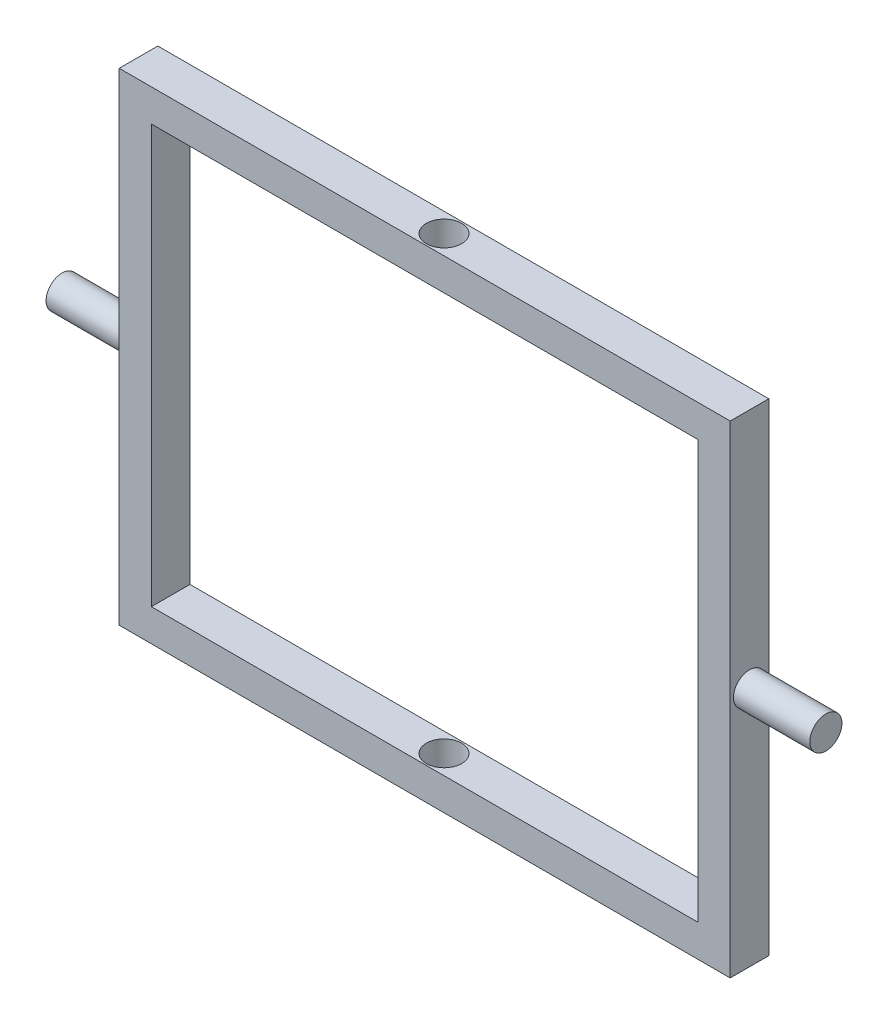
ISO-10303-21;
HEADER;
FILE_DESCRIPTION(('STEP AP214'),'2;1');
FILE_NAME('part.step','',(''),(''),'','','');
FILE_SCHEMA(('AUTOMOTIVE_DESIGN { 1 0 10303 214 1 1 1 1 }'));
ENDSEC;
DATA;
#1=APPLICATION_CONTEXT('core data for automotive mechanical design processes');
#2=APPLICATION_PROTOCOL_DEFINITION('international standard','automotive_design',2000,#1);
#3=PRODUCT_CONTEXT('',#1,'mechanical');
#4=PRODUCT('Part','Part','',(#3));
#5=PRODUCT_RELATED_PRODUCT_CATEGORY('part','',(#4));
#6=PRODUCT_DEFINITION_FORMATION('','',#4);
#7=PRODUCT_DEFINITION_CONTEXT('part definition',#1,'design');
#8=PRODUCT_DEFINITION('design','',#6,#7);
#9=PRODUCT_DEFINITION_SHAPE('','',#8);
#10=(LENGTH_UNIT() NAMED_UNIT(*) SI_UNIT(.MILLI.,.METRE.));
#11=(NAMED_UNIT(*) PLANE_ANGLE_UNIT() SI_UNIT($,.RADIAN.));
#12=(NAMED_UNIT(*) SI_UNIT($,.STERADIAN.) SOLID_ANGLE_UNIT());
#13=UNCERTAINTY_MEASURE_WITH_UNIT(LENGTH_MEASURE(1.E-05),#10,'distance_accuracy_value','');
#14=(GEOMETRIC_REPRESENTATION_CONTEXT(3) GLOBAL_UNCERTAINTY_ASSIGNED_CONTEXT((#13)) GLOBAL_UNIT_ASSIGNED_CONTEXT((#10,
#11,#12)) REPRESENTATION_CONTEXT('',''));
#15=CARTESIAN_POINT('',(0.,0.,0.));
#16=DIRECTION('',(0.,0.,1.));
#17=DIRECTION('',(1.,0.,0.));
#18=AXIS2_PLACEMENT_3D('',#15,#16,#17);
#19=CARTESIAN_POINT('',(475.,375.,-30.));
#20=DIRECTION('',(1.,0.,0.));
#21=DIRECTION('',(0.,1.,0.));
#22=AXIS2_PLACEMENT_3D('',#19,#20,#21);
#23=PLANE('',#22);
#24=CARTESIAN_POINT('',(475.,0.,0.));
#25=DIRECTION('',(1.,0.,0.));
#26=DIRECTION('',(0.,1.,0.));
#27=AXIS2_PLACEMENT_3D('',#24,#25,#26);
#28=CIRCLE('',#27,25.);
#29=CARTESIAN_POINT('',(475.,-24.9999999999999,0.));
#30=VERTEX_POINT('',#29);
#31=EDGE_CURVE('E199',#30,#30,#28,.T.);
#32=ORIENTED_EDGE('',*,*,#31,.F.);
#33=EDGE_LOOP('',(#32));
#34=FACE_BOUND('',#33,.T.);
#35=DIRECTION('',(0.,0.,1.));
#36=VECTOR('',#35,1.);
#37=CARTESIAN_POINT('',(475.,375.,-30.));
#38=LINE('',#37,#36);
#39=CARTESIAN_POINT('',(475.,375.,-30.));
#40=VERTEX_POINT('',#39);
#41=CARTESIAN_POINT('',(475.,375.,30.));
#42=VERTEX_POINT('',#41);
#43=EDGE_CURVE('E162',#40,#42,#38,.T.);
#44=ORIENTED_EDGE('',*,*,#43,.T.);
#45=DIRECTION('',(0.,1.,0.));
#46=VECTOR('',#45,1.);
#47=CARTESIAN_POINT('',(475.,375.,30.));
#48=LINE('',#47,#46);
#49=CARTESIAN_POINT('',(475.,-375.,30.));
#50=VERTEX_POINT('',#49);
#51=EDGE_CURVE('E129',#50,#42,#48,.T.);
#52=ORIENTED_EDGE('',*,*,#51,.F.);
#53=DIRECTION('',(0.,0.,1.));
#54=VECTOR('',#53,1.);
#55=CARTESIAN_POINT('',(475.,-375.,-30.));
#56=LINE('',#55,#54);
#57=CARTESIAN_POINT('',(475.,-375.,-30.));
#58=VERTEX_POINT('',#57);
#59=EDGE_CURVE('E40',#58,#50,#56,.T.);
#60=ORIENTED_EDGE('',*,*,#59,.F.);
#61=DIRECTION('',(0.,1.,0.));
#62=VECTOR('',#61,1.);
#63=CARTESIAN_POINT('',(475.,375.,-30.));
#64=LINE('',#63,#62);
#65=EDGE_CURVE('E148',#58,#40,#64,.T.);
#66=ORIENTED_EDGE('',*,*,#65,.T.);
#67=EDGE_LOOP('',(#44,#52,#60,#66));
#68=FACE_BOUND('',#67,.T.);
#69=ADVANCED_FACE('F33',(#34,#68),#23,.T.);
#70=CARTESIAN_POINT('',(-475.,-375.,-30.));
#71=DIRECTION('',(0.,-1.,0.));
#72=DIRECTION('',(0.,0.,-1.));
#73=AXIS2_PLACEMENT_3D('',#70,#71,#72);
#74=PLANE('',#73);
#75=CARTESIAN_POINT('',(0.,-375.,0.));
#76=DIRECTION('',(0.,-1.,0.));
#77=DIRECTION('',(0.,0.,-1.));
#78=AXIS2_PLACEMENT_3D('',#75,#76,#77);
#79=CIRCLE('',#78,27.5);
#80=CARTESIAN_POINT('',(0.,-375.,-27.5));
#81=VERTEX_POINT('',#80);
#82=EDGE_CURVE('E213',#81,#81,#79,.F.);
#83=ORIENTED_EDGE('',*,*,#82,.T.);
#84=EDGE_LOOP('',(#83));
#85=FACE_BOUND('',#84,.T.);
#86=ORIENTED_EDGE('',*,*,#59,.T.);
#87=DIRECTION('',(1.,0.,0.));
#88=VECTOR('',#87,1.);
#89=CARTESIAN_POINT('',(-475.,-375.,30.));
#90=LINE('',#89,#88);
#91=CARTESIAN_POINT('',(-475.,-375.,30.));
#92=VERTEX_POINT('',#91);
#93=EDGE_CURVE('E138',#92,#50,#90,.T.);
#94=ORIENTED_EDGE('',*,*,#93,.F.);
#95=DIRECTION('',(0.,0.,1.));
#96=VECTOR('',#95,1.);
#97=CARTESIAN_POINT('',(-475.,-375.,-30.));
#98=LINE('',#97,#96);
#99=CARTESIAN_POINT('',(-475.,-375.,-30.));
#100=VERTEX_POINT('',#99);
#101=EDGE_CURVE('E164',#100,#92,#98,.T.);
#102=ORIENTED_EDGE('',*,*,#101,.F.);
#103=DIRECTION('',(1.,0.,0.));
#104=VECTOR('',#103,1.);
#105=CARTESIAN_POINT('',(-475.,-375.,-30.));
#106=LINE('',#105,#104);
#107=EDGE_CURVE('E159',#100,#58,#106,.T.);
#108=ORIENTED_EDGE('',*,*,#107,.T.);
#109=EDGE_LOOP('',(#86,#94,#102,#108));
#110=FACE_BOUND('',#109,.T.);
#111=ADVANCED_FACE('F175',(#85,#110),#74,.T.);
#112=CARTESIAN_POINT('',(-475.,375.,-30.));
#113=DIRECTION('',(-1.,0.,0.));
#114=DIRECTION('',(0.,-1.,0.));
#115=AXIS2_PLACEMENT_3D('',#112,#113,#114);
#116=PLANE('',#115);
#117=CARTESIAN_POINT('',(-475.,0.,0.));
#118=DIRECTION('',(-1.,0.,0.));
#119=DIRECTION('',(0.,-1.,0.));
#120=AXIS2_PLACEMENT_3D('',#117,#118,#119);
#121=CIRCLE('',#120,25.);
#122=CARTESIAN_POINT('',(-475.,25.0000000000001,0.));
#123=VERTEX_POINT('',#122);
#124=EDGE_CURVE('E11',#123,#123,#121,.T.);
#125=ORIENTED_EDGE('',*,*,#124,.F.);
#126=EDGE_LOOP('',(#125));
#127=FACE_BOUND('',#126,.T.);
#128=ORIENTED_EDGE('',*,*,#101,.T.);
#129=DIRECTION('',(0.,-1.,0.));
#130=VECTOR('',#129,1.);
#131=CARTESIAN_POINT('',(-475.,375.,30.));
#132=LINE('',#131,#130);
#133=CARTESIAN_POINT('',(-475.,375.,30.));
#134=VERTEX_POINT('',#133);
#135=EDGE_CURVE('E135',#134,#92,#132,.T.);
#136=ORIENTED_EDGE('',*,*,#135,.F.);
#137=DIRECTION('',(0.,0.,1.));
#138=VECTOR('',#137,1.);
#139=CARTESIAN_POINT('',(-475.,375.,-30.));
#140=LINE('',#139,#138);
#141=CARTESIAN_POINT('',(-475.,375.,-30.));
#142=VERTEX_POINT('',#141);
#143=EDGE_CURVE('E166',#142,#134,#140,.T.);
#144=ORIENTED_EDGE('',*,*,#143,.F.);
#145=DIRECTION('',(0.,-1.,0.));
#146=VECTOR('',#145,1.);
#147=CARTESIAN_POINT('',(-475.,375.,-30.));
#148=LINE('',#147,#146);
#149=EDGE_CURVE('E156',#142,#100,#148,.T.);
#150=ORIENTED_EDGE('',*,*,#149,.T.);
#151=EDGE_LOOP('',(#128,#136,#144,#150));
#152=FACE_BOUND('',#151,.T.);
#153=ADVANCED_FACE('F181',(#127,#152),#116,.T.);
#154=CARTESIAN_POINT('',(-475.,375.,-30.));
#155=DIRECTION('',(0.,1.,0.));
#156=DIRECTION('',(0.,0.,1.));
#157=AXIS2_PLACEMENT_3D('',#154,#155,#156);
#158=PLANE('',#157);
#159=CARTESIAN_POINT('',(0.,375.,0.));
#160=DIRECTION('',(0.,1.,0.));
#161=DIRECTION('',(0.,0.,1.));
#162=AXIS2_PLACEMENT_3D('',#159,#160,#161);
#163=CIRCLE('',#162,27.5);
#164=CARTESIAN_POINT('',(0.,375.,27.5));
#165=VERTEX_POINT('',#164);
#166=EDGE_CURVE('E205',#165,#165,#163,.T.);
#167=ORIENTED_EDGE('',*,*,#166,.F.);
#168=EDGE_LOOP('',(#167));
#169=FACE_BOUND('',#168,.T.);
#170=ORIENTED_EDGE('',*,*,#143,.T.);
#171=DIRECTION('',(-1.,0.,0.));
#172=VECTOR('',#171,1.);
#173=CARTESIAN_POINT('',(-475.,375.,30.));
#174=LINE('',#173,#172);
#175=EDGE_CURVE('E132',#42,#134,#174,.T.);
#176=ORIENTED_EDGE('',*,*,#175,.F.);
#177=ORIENTED_EDGE('',*,*,#43,.F.);
#178=DIRECTION('',(-1.,0.,0.));
#179=VECTOR('',#178,1.);
#180=CARTESIAN_POINT('',(-475.,375.,-30.));
#181=LINE('',#180,#179);
#182=EDGE_CURVE('E153',#40,#142,#181,.T.);
#183=ORIENTED_EDGE('',*,*,#182,.T.);
#184=EDGE_LOOP('',(#170,#176,#177,#183));
#185=FACE_BOUND('',#184,.T.);
#186=ADVANCED_FACE('F170',(#169,#185),#158,.T.);
#187=CARTESIAN_POINT('',(0.,0.,-30.));
#188=DIRECTION('',(0.,0.,1.));
#189=DIRECTION('',(1.,0.,0.));
#190=AXIS2_PLACEMENT_3D('',#187,#188,#189);
#191=PLANE('',#190);
#192=DIRECTION('',(1.,0.,0.));
#193=VECTOR('',#192,1.);
#194=CARTESIAN_POINT('',(-425.,-325.,-30.));
#195=LINE('',#194,#193);
#196=CARTESIAN_POINT('',(-425.,-325.,-30.));
#197=VERTEX_POINT('',#196);
#198=CARTESIAN_POINT('',(425.,-325.,-30.));
#199=VERTEX_POINT('',#198);
#200=EDGE_CURVE('E109',#197,#199,#195,.T.);
#201=ORIENTED_EDGE('',*,*,#200,.T.);
#202=DIRECTION('',(0.,1.,0.));
#203=VECTOR('',#202,1.);
#204=CARTESIAN_POINT('',(425.,325.,-30.));
#205=LINE('',#204,#203);
#206=CARTESIAN_POINT('',(425.,325.,-30.));
#207=VERTEX_POINT('',#206);
#208=EDGE_CURVE('E141',#199,#207,#205,.T.);
#209=ORIENTED_EDGE('',*,*,#208,.T.);
#210=DIRECTION('',(-1.,0.,0.));
#211=VECTOR('',#210,1.);
#212=CARTESIAN_POINT('',(-425.,325.,-30.));
#213=LINE('',#212,#211);
#214=CARTESIAN_POINT('',(-425.,325.,-30.));
#215=VERTEX_POINT('',#214);
#216=EDGE_CURVE('E104',#207,#215,#213,.T.);
#217=ORIENTED_EDGE('',*,*,#216,.T.);
#218=DIRECTION('',(0.,-1.,0.));
#219=VECTOR('',#218,1.);
#220=CARTESIAN_POINT('',(-425.,325.,-30.));
#221=LINE('',#220,#219);
#222=EDGE_CURVE('E47',#215,#197,#221,.T.);
#223=ORIENTED_EDGE('',*,*,#222,.T.);
#224=EDGE_LOOP('',(#201,#209,#217,#223));
#225=FACE_BOUND('',#224,.T.);
#226=ORIENTED_EDGE('',*,*,#65,.F.);
#227=ORIENTED_EDGE('',*,*,#107,.F.);
#228=ORIENTED_EDGE('',*,*,#149,.F.);
#229=ORIENTED_EDGE('',*,*,#182,.F.);
#230=EDGE_LOOP('',(#226,#227,#228,#229));
#231=FACE_BOUND('',#230,.T.);
#232=ADVANCED_FACE('F179',(#225,#231),#191,.F.);
#233=CARTESIAN_POINT('',(425.,325.,-30.));
#234=DIRECTION('',(1.,0.,0.));
#235=DIRECTION('',(0.,1.,0.));
#236=AXIS2_PLACEMENT_3D('',#233,#234,#235);
#237=PLANE('',#236);
#238=DIRECTION('',(0.,0.,1.));
#239=VECTOR('',#238,1.);
#240=CARTESIAN_POINT('',(425.,-325.,-30.));
#241=LINE('',#240,#239);
#242=CARTESIAN_POINT('',(425.,-325.,30.));
#243=VERTEX_POINT('',#242);
#244=EDGE_CURVE('E114',#199,#243,#241,.T.);
#245=ORIENTED_EDGE('',*,*,#244,.T.);
#246=DIRECTION('',(0.,1.,0.));
#247=VECTOR('',#246,1.);
#248=CARTESIAN_POINT('',(425.,325.,30.));
#249=LINE('',#248,#247);
#250=CARTESIAN_POINT('',(425.,325.,30.));
#251=VERTEX_POINT('',#250);
#252=EDGE_CURVE('E112',#243,#251,#249,.T.);
#253=ORIENTED_EDGE('',*,*,#252,.T.);
#254=DIRECTION('',(0.,0.,1.));
#255=VECTOR('',#254,1.);
#256=CARTESIAN_POINT('',(425.,325.,-30.));
#257=LINE('',#256,#255);
#258=EDGE_CURVE('E97',#207,#251,#257,.T.);
#259=ORIENTED_EDGE('',*,*,#258,.F.);
#260=ORIENTED_EDGE('',*,*,#208,.F.);
#261=EDGE_LOOP('',(#245,#253,#259,#260));
#262=FACE_BOUND('',#261,.T.);
#263=ADVANCED_FACE('F113',(#262),#237,.F.);
#264=CARTESIAN_POINT('',(-425.,-325.,-30.));
#265=DIRECTION('',(0.,-1.,0.));
#266=DIRECTION('',(0.,0.,-1.));
#267=AXIS2_PLACEMENT_3D('',#264,#265,#266);
#268=PLANE('',#267);
#269=CARTESIAN_POINT('',(0.,-325.,0.));
#270=DIRECTION('',(0.,-1.,0.));
#271=DIRECTION('',(0.,0.,-1.));
#272=AXIS2_PLACEMENT_3D('',#269,#270,#271);
#273=CIRCLE('',#272,27.5);
#274=CARTESIAN_POINT('',(0.,-325.,-27.5));
#275=VERTEX_POINT('',#274);
#276=EDGE_CURVE('E216',#275,#275,#273,.T.);
#277=ORIENTED_EDGE('',*,*,#276,.T.);
#278=EDGE_LOOP('',(#277));
#279=FACE_BOUND('',#278,.T.);
#280=DIRECTION('',(0.,0.,1.));
#281=VECTOR('',#280,1.);
#282=CARTESIAN_POINT('',(-425.,-325.,-30.));
#283=LINE('',#282,#281);
#284=CARTESIAN_POINT('',(-425.,-325.,30.));
#285=VERTEX_POINT('',#284);
#286=EDGE_CURVE('E149',#197,#285,#283,.T.);
#287=ORIENTED_EDGE('',*,*,#286,.T.);
#288=DIRECTION('',(1.,0.,0.));
#289=VECTOR('',#288,1.);
#290=CARTESIAN_POINT('',(-425.,-325.,30.));
#291=LINE('',#290,#289);
#292=EDGE_CURVE('E124',#285,#243,#291,.T.);
#293=ORIENTED_EDGE('',*,*,#292,.T.);
#294=ORIENTED_EDGE('',*,*,#244,.F.);
#295=ORIENTED_EDGE('',*,*,#200,.F.);
#296=EDGE_LOOP('',(#287,#293,#294,#295));
#297=FACE_BOUND('',#296,.T.);
#298=ADVANCED_FACE('F220',(#279,#297),#268,.F.);
#299=CARTESIAN_POINT('',(-425.,325.,-30.));
#300=DIRECTION('',(-1.,0.,0.));
#301=DIRECTION('',(0.,-1.,0.));
#302=AXIS2_PLACEMENT_3D('',#299,#300,#301);
#303=PLANE('',#302);
#304=DIRECTION('',(0.,0.,1.));
#305=VECTOR('',#304,1.);
#306=CARTESIAN_POINT('',(-425.,325.,-30.));
#307=LINE('',#306,#305);
#308=CARTESIAN_POINT('',(-425.,325.,30.));
#309=VERTEX_POINT('',#308);
#310=EDGE_CURVE('E108',#215,#309,#307,.T.);
#311=ORIENTED_EDGE('',*,*,#310,.T.);
#312=DIRECTION('',(0.,-1.,0.));
#313=VECTOR('',#312,1.);
#314=CARTESIAN_POINT('',(-425.,325.,30.));
#315=LINE('',#314,#313);
#316=EDGE_CURVE('E122',#309,#285,#315,.T.);
#317=ORIENTED_EDGE('',*,*,#316,.T.);
#318=ORIENTED_EDGE('',*,*,#286,.F.);
#319=ORIENTED_EDGE('',*,*,#222,.F.);
#320=EDGE_LOOP('',(#311,#317,#318,#319));
#321=FACE_BOUND('',#320,.T.);
#322=ADVANCED_FACE('F255',(#321),#303,.F.);
#323=CARTESIAN_POINT('',(-425.,325.,-30.));
#324=DIRECTION('',(0.,1.,0.));
#325=DIRECTION('',(0.,0.,1.));
#326=AXIS2_PLACEMENT_3D('',#323,#324,#325);
#327=PLANE('',#326);
#328=CARTESIAN_POINT('',(0.,325.,0.));
#329=DIRECTION('',(0.,-1.,0.));
#330=DIRECTION('',(0.,0.,-1.));
#331=AXIS2_PLACEMENT_3D('',#328,#329,#330);
#332=CIRCLE('',#331,27.5);
#333=CARTESIAN_POINT('',(0.,325.,-27.5));
#334=VERTEX_POINT('',#333);
#335=EDGE_CURVE('E210',#334,#334,#332,.T.);
#336=ORIENTED_EDGE('',*,*,#335,.F.);
#337=EDGE_LOOP('',(#336));
#338=FACE_BOUND('',#337,.T.);
#339=ORIENTED_EDGE('',*,*,#258,.T.);
#340=DIRECTION('',(-1.,0.,0.));
#341=VECTOR('',#340,1.);
#342=CARTESIAN_POINT('',(-425.,325.,30.));
#343=LINE('',#342,#341);
#344=EDGE_CURVE('E101',#251,#309,#343,.T.);
#345=ORIENTED_EDGE('',*,*,#344,.T.);
#346=ORIENTED_EDGE('',*,*,#310,.F.);
#347=ORIENTED_EDGE('',*,*,#216,.F.);
#348=EDGE_LOOP('',(#339,#345,#346,#347));
#349=FACE_BOUND('',#348,.T.);
#350=ADVANCED_FACE('F99',(#338,#349),#327,.F.);
#351=CARTESIAN_POINT('',(0.,0.,30.));
#352=DIRECTION('',(0.,0.,1.));
#353=DIRECTION('',(1.,0.,0.));
#354=AXIS2_PLACEMENT_3D('',#351,#352,#353);
#355=PLANE('',#354);
#356=ORIENTED_EDGE('',*,*,#51,.T.);
#357=ORIENTED_EDGE('',*,*,#175,.T.);
#358=ORIENTED_EDGE('',*,*,#135,.T.);
#359=ORIENTED_EDGE('',*,*,#93,.T.);
#360=EDGE_LOOP('',(#356,#357,#358,#359));
#361=FACE_BOUND('',#360,.T.);
#362=ORIENTED_EDGE('',*,*,#344,.F.);
#363=ORIENTED_EDGE('',*,*,#252,.F.);
#364=ORIENTED_EDGE('',*,*,#292,.F.);
#365=ORIENTED_EDGE('',*,*,#316,.F.);
#366=EDGE_LOOP('',(#362,#363,#364,#365));
#367=FACE_BOUND('',#366,.T.);
#368=ADVANCED_FACE('F120',(#361,#367),#355,.T.);
#369=CARTESIAN_POINT('',(593.75,0.,0.));
#370=DIRECTION('',(-1.,0.,0.));
#371=DIRECTION('',(0.,-1.,0.));
#372=AXIS2_PLACEMENT_3D('',#369,#370,#371);
#373=CYLINDRICAL_SURFACE('',#372,25.);
#374=CARTESIAN_POINT('',(593.75,0.,0.));
#375=DIRECTION('',(1.,0.,0.));
#376=DIRECTION('',(0.,1.,0.));
#377=AXIS2_PLACEMENT_3D('',#374,#375,#376);
#378=CIRCLE('',#377,25.);
#379=CARTESIAN_POINT('',(593.75,-24.9999999999999,0.));
#380=VERTEX_POINT('',#379);
#381=EDGE_CURVE('E118',#380,#380,#378,.T.);
#382=CARTESIAN_POINT('',(593.75,-24.9999999999999,0.));
#383=CARTESIAN_POINT('',(592.513020833334,-24.9999999999999,0.));
#384=CARTESIAN_POINT('',(591.276041666667,-24.9999999999999,0.));
#385=CARTESIAN_POINT('',(588.802083333333,-24.9999999999999,0.));
#386=CARTESIAN_POINT('',(587.565104166667,-24.9999999999999,0.));
#387=CARTESIAN_POINT('',(585.091145833334,-24.9999999999999,0.));
#388=CARTESIAN_POINT('',(583.854166666667,-24.9999999999999,0.));
#389=CARTESIAN_POINT('',(581.380208333333,-24.9999999999999,0.));
#390=CARTESIAN_POINT('',(580.143229166667,-24.9999999999999,0.));
#391=CARTESIAN_POINT('',(577.669270833333,-24.9999999999999,0.));
#392=CARTESIAN_POINT('',(576.432291666667,-24.9999999999999,0.));
#393=CARTESIAN_POINT('',(573.958333333334,-24.9999999999999,0.));
#394=CARTESIAN_POINT('',(572.721354166667,-24.9999999999999,0.));
#395=CARTESIAN_POINT('',(570.247395833333,-24.9999999999999,0.));
#396=CARTESIAN_POINT('',(569.010416666667,-24.9999999999999,0.));
#397=CARTESIAN_POINT('',(566.536458333334,-24.9999999999999,0.));
#398=CARTESIAN_POINT('',(565.299479166667,-24.9999999999999,0.));
#399=CARTESIAN_POINT('',(562.825520833333,-24.9999999999999,0.));
#400=CARTESIAN_POINT('',(561.588541666667,-24.9999999999999,0.));
#401=CARTESIAN_POINT('',(559.114583333333,-24.9999999999999,0.));
#402=CARTESIAN_POINT('',(557.877604166667,-24.9999999999999,0.));
#403=CARTESIAN_POINT('',(555.403645833334,-24.9999999999999,0.));
#404=CARTESIAN_POINT('',(554.166666666667,-24.9999999999999,0.));
#405=CARTESIAN_POINT('',(551.692708333333,-24.9999999999999,0.));
#406=CARTESIAN_POINT('',(550.455729166667,-24.9999999999999,0.));
#407=CARTESIAN_POINT('',(547.981770833334,-24.9999999999999,0.));
#408=CARTESIAN_POINT('',(546.744791666667,-24.9999999999999,0.));
#409=CARTESIAN_POINT('',(544.270833333333,-24.9999999999999,0.));
#410=CARTESIAN_POINT('',(543.033854166667,-24.9999999999999,0.));
#411=CARTESIAN_POINT('',(540.559895833333,-24.9999999999999,0.));
#412=CARTESIAN_POINT('',(539.322916666667,-24.9999999999999,0.));
#413=CARTESIAN_POINT('',(536.848958333333,-24.9999999999999,0.));
#414=CARTESIAN_POINT('',(535.611979166667,-24.9999999999999,0.));
#415=CARTESIAN_POINT('',(533.138020833333,-24.9999999999999,0.));
#416=CARTESIAN_POINT('',(531.901041666667,-24.9999999999999,0.));
#417=CARTESIAN_POINT('',(529.427083333334,-24.9999999999999,0.));
#418=CARTESIAN_POINT('',(528.190104166667,-24.9999999999999,0.));
#419=CARTESIAN_POINT('',(525.716145833333,-24.9999999999999,0.));
#420=CARTESIAN_POINT('',(524.479166666667,-24.9999999999999,0.));
#421=CARTESIAN_POINT('',(522.005208333333,-24.9999999999999,0.));
#422=CARTESIAN_POINT('',(520.768229166667,-24.9999999999999,0.));
#423=CARTESIAN_POINT('',(518.294270833334,-24.9999999999999,0.));
#424=CARTESIAN_POINT('',(517.057291666667,-24.9999999999999,0.));
#425=CARTESIAN_POINT('',(514.583333333333,-24.9999999999999,0.));
#426=CARTESIAN_POINT('',(513.346354166667,-24.9999999999999,0.));
#427=CARTESIAN_POINT('',(510.872395833334,-24.9999999999999,0.));
#428=CARTESIAN_POINT('',(509.635416666667,-24.9999999999999,0.));
#429=CARTESIAN_POINT('',(507.161458333333,-24.9999999999999,0.));
#430=CARTESIAN_POINT('',(505.924479166667,-24.9999999999999,0.));
#431=CARTESIAN_POINT('',(503.450520833334,-24.9999999999999,0.));
#432=CARTESIAN_POINT('',(502.213541666667,-24.9999999999999,0.));
#433=CARTESIAN_POINT('',(499.739583333334,-24.9999999999999,0.));
#434=CARTESIAN_POINT('',(498.502604166667,-24.9999999999999,0.));
#435=CARTESIAN_POINT('',(496.028645833333,-24.9999999999999,0.));
#436=CARTESIAN_POINT('',(494.791666666667,-24.9999999999999,0.));
#437=CARTESIAN_POINT('',(492.317708333333,-24.9999999999999,0.));
#438=CARTESIAN_POINT('',(491.080729166667,-24.9999999999999,0.));
#439=CARTESIAN_POINT('',(488.606770833333,-24.9999999999999,0.));
#440=CARTESIAN_POINT('',(487.369791666667,-24.9999999999999,0.));
#441=CARTESIAN_POINT('',(484.895833333334,-24.9999999999999,0.));
#442=CARTESIAN_POINT('',(483.658854166667,-24.9999999999999,0.));
#443=CARTESIAN_POINT('',(481.184895833334,-24.9999999999999,0.));
#444=CARTESIAN_POINT('',(479.947916666667,-24.9999999999999,0.));
#445=CARTESIAN_POINT('',(477.473958333333,-24.9999999999999,0.));
#446=CARTESIAN_POINT('',(476.236979166667,-24.9999999999999,0.));
#447=CARTESIAN_POINT('',(475.,-24.9999999999999,0.));
#448=B_SPLINE_CURVE_WITH_KNOTS('',3,(#382,#383,#384,#385,#386,#387,#388,#389,#390,#391,#392,
#393,#394,#395,#396,#397,#398,#399,#400,#401,#402,#403,#404,#405,#406,#407,#408,#409,#410,#411,
#412,#413,#414,#415,#416,#417,#418,#419,#420,#421,#422,#423,#424,#425,#426,#427,#428,#429,#430,
#431,#432,#433,#434,#435,#436,#437,#438,#439,#440,#441,#442,#443,#444,#445,#446,#447),
.UNSPECIFIED.,.F.,.F.,(4,2,2,2,2,2,2,2,2,2,2,2,2,2,2,2,2,2,2,2,2,2,2,2,2,2,2,2,2,2,2,2,4),(0.,
3.71093750000007,7.42187500000002,11.1328125000001,14.84375,18.5546875,22.2656250000001,
25.9765625,29.6875000000001,33.3984375,37.109375,40.8203125000001,44.53125,48.2421875000001,
51.953125,55.6640625000001,59.3750000000001,63.0859375,66.7968750000001,70.5078125,74.21875,
77.9296875000001,81.640625,85.3515625000001,89.0625,92.7734375,96.4843750000001,100.1953125,
103.90625,107.6171875,111.328125,115.0390625,118.75),.UNSPECIFIED.);
#449=EDGE_CURVE('BSEAM246',#380,#30,#448,.T.);
#450=ORIENTED_EDGE('',*,*,#381,.F.);
#451=ORIENTED_EDGE('',*,*,#31,.T.);
#452=ORIENTED_EDGE('',*,*,#449,.T.);
#453=ORIENTED_EDGE('',*,*,#449,.F.);
#454=EDGE_LOOP('',(#450,#452,#451,#453));
#455=FACE_BOUND('',#454,.T.);
#456=ADVANCED_FACE('F246',(#455),#373,.T.);
#457=CARTESIAN_POINT('',(593.75,0.,0.));
#458=DIRECTION('',(1.,0.,0.));
#459=DIRECTION('',(0.,1.,0.));
#460=AXIS2_PLACEMENT_3D('',#457,#458,#459);
#461=PLANE('',#460);
#462=ORIENTED_EDGE('',*,*,#381,.T.);
#463=EDGE_LOOP('',(#462));
#464=FACE_BOUND('',#463,.T.);
#465=ADVANCED_FACE('F242',(#464),#461,.T.);
#466=CARTESIAN_POINT('',(-593.75,0.,0.));
#467=DIRECTION('',(1.,0.,0.));
#468=DIRECTION('',(0.,1.,0.));
#469=AXIS2_PLACEMENT_3D('',#466,#467,#468);
#470=CYLINDRICAL_SURFACE('',#469,25.);
#471=CARTESIAN_POINT('',(-593.75,0.,0.));
#472=DIRECTION('',(1.,0.,0.));
#473=DIRECTION('',(0.,1.,0.));
#474=AXIS2_PLACEMENT_3D('',#471,#472,#473);
#475=CIRCLE('',#474,25.);
#476=CARTESIAN_POINT('',(-593.75,25.0000000000001,0.));
#477=VERTEX_POINT('',#476);
#478=EDGE_CURVE('E201',#477,#477,#475,.T.);
#479=CARTESIAN_POINT('',(-593.75,25.0000000000001,0.));
#480=CARTESIAN_POINT('',(-592.513020833333,25.0000000000001,0.));
#481=CARTESIAN_POINT('',(-591.276041666667,25.0000000000001,0.));
#482=CARTESIAN_POINT('',(-588.802083333333,25.0000000000001,0.));
#483=CARTESIAN_POINT('',(-587.565104166667,25.0000000000001,0.));
#484=CARTESIAN_POINT('',(-585.091145833333,25.0000000000001,0.));
#485=CARTESIAN_POINT('',(-583.854166666667,25.0000000000001,0.));
#486=CARTESIAN_POINT('',(-581.380208333333,25.0000000000001,0.));
#487=CARTESIAN_POINT('',(-580.143229166667,25.0000000000001,0.));
#488=CARTESIAN_POINT('',(-577.669270833333,25.0000000000001,0.));
#489=CARTESIAN_POINT('',(-576.432291666667,25.0000000000001,0.));
#490=CARTESIAN_POINT('',(-573.958333333333,25.0000000000001,0.));
#491=CARTESIAN_POINT('',(-572.721354166667,25.0000000000001,0.));
#492=CARTESIAN_POINT('',(-570.247395833333,25.0000000000001,0.));
#493=CARTESIAN_POINT('',(-569.010416666667,25.0000000000001,0.));
#494=CARTESIAN_POINT('',(-566.536458333333,25.0000000000001,0.));
#495=CARTESIAN_POINT('',(-565.299479166667,25.0000000000001,0.));
#496=CARTESIAN_POINT('',(-562.825520833333,25.0000000000001,0.));
#497=CARTESIAN_POINT('',(-561.588541666667,25.0000000000001,0.));
#498=CARTESIAN_POINT('',(-559.114583333333,25.0000000000001,0.));
#499=CARTESIAN_POINT('',(-557.877604166667,25.0000000000001,0.));
#500=CARTESIAN_POINT('',(-555.403645833333,25.0000000000001,0.));
#501=CARTESIAN_POINT('',(-554.166666666667,25.0000000000001,0.));
#502=CARTESIAN_POINT('',(-551.692708333333,25.0000000000001,0.));
#503=CARTESIAN_POINT('',(-550.455729166667,25.0000000000001,0.));
#504=CARTESIAN_POINT('',(-547.981770833333,25.0000000000001,0.));
#505=CARTESIAN_POINT('',(-546.744791666667,25.0000000000001,0.));
#506=CARTESIAN_POINT('',(-544.270833333333,25.0000000000001,0.));
#507=CARTESIAN_POINT('',(-543.033854166667,25.0000000000001,0.));
#508=CARTESIAN_POINT('',(-540.559895833333,25.0000000000001,0.));
#509=CARTESIAN_POINT('',(-539.322916666667,25.0000000000001,0.));
#510=CARTESIAN_POINT('',(-536.848958333333,25.0000000000001,0.));
#511=CARTESIAN_POINT('',(-535.611979166667,25.0000000000001,0.));
#512=CARTESIAN_POINT('',(-533.138020833333,25.0000000000001,0.));
#513=CARTESIAN_POINT('',(-531.901041666667,25.0000000000001,0.));
#514=CARTESIAN_POINT('',(-529.427083333333,25.0000000000001,0.));
#515=CARTESIAN_POINT('',(-528.190104166667,25.0000000000001,0.));
#516=CARTESIAN_POINT('',(-525.716145833333,25.0000000000001,0.));
#517=CARTESIAN_POINT('',(-524.479166666667,25.0000000000001,0.));
#518=CARTESIAN_POINT('',(-522.005208333333,25.0000000000001,0.));
#519=CARTESIAN_POINT('',(-520.768229166667,25.0000000000001,0.));
#520=CARTESIAN_POINT('',(-518.294270833333,25.0000000000001,0.));
#521=CARTESIAN_POINT('',(-517.057291666667,25.0000000000001,0.));
#522=CARTESIAN_POINT('',(-514.583333333333,25.0000000000001,0.));
#523=CARTESIAN_POINT('',(-513.346354166667,25.0000000000001,0.));
#524=CARTESIAN_POINT('',(-510.872395833333,25.0000000000001,0.));
#525=CARTESIAN_POINT('',(-509.635416666667,25.0000000000001,0.));
#526=CARTESIAN_POINT('',(-507.161458333333,25.0000000000001,0.));
#527=CARTESIAN_POINT('',(-505.924479166667,25.0000000000001,0.));
#528=CARTESIAN_POINT('',(-503.450520833333,25.0000000000001,0.));
#529=CARTESIAN_POINT('',(-502.213541666667,25.0000000000001,0.));
#530=CARTESIAN_POINT('',(-499.739583333333,25.0000000000001,0.));
#531=CARTESIAN_POINT('',(-498.502604166667,25.0000000000001,0.));
#532=CARTESIAN_POINT('',(-496.028645833333,25.0000000000001,0.));
#533=CARTESIAN_POINT('',(-494.791666666667,25.0000000000001,0.));
#534=CARTESIAN_POINT('',(-492.317708333333,25.0000000000001,0.));
#535=CARTESIAN_POINT('',(-491.080729166667,25.0000000000001,0.));
#536=CARTESIAN_POINT('',(-488.606770833333,25.0000000000001,0.));
#537=CARTESIAN_POINT('',(-487.369791666667,25.0000000000001,0.));
#538=CARTESIAN_POINT('',(-484.895833333333,25.0000000000001,0.));
#539=CARTESIAN_POINT('',(-483.658854166666,25.0000000000001,0.));
#540=CARTESIAN_POINT('',(-481.184895833333,25.0000000000001,0.));
#541=CARTESIAN_POINT('',(-479.947916666666,25.0000000000001,0.));
#542=CARTESIAN_POINT('',(-477.473958333333,25.0000000000001,0.));
#543=CARTESIAN_POINT('',(-476.236979166666,25.0000000000001,0.));
#544=CARTESIAN_POINT('',(-475.,25.0000000000001,0.));
#545=B_SPLINE_CURVE_WITH_KNOTS('',3,(#479,#480,#481,#482,#483,#484,#485,#486,#487,#488,#489,
#490,#491,#492,#493,#494,#495,#496,#497,#498,#499,#500,#501,#502,#503,#504,#505,#506,#507,#508,
#509,#510,#511,#512,#513,#514,#515,#516,#517,#518,#519,#520,#521,#522,#523,#524,#525,#526,#527,
#528,#529,#530,#531,#532,#533,#534,#535,#536,#537,#538,#539,#540,#541,#542,#543,#544),
.UNSPECIFIED.,.F.,.F.,(4,2,2,2,2,2,2,2,2,2,2,2,2,2,2,2,2,2,2,2,2,2,2,2,2,2,2,2,2,2,2,2,4),(0.,
3.71093749999996,7.42187499999991,11.1328125,14.8437499999999,18.5546875,22.265625,25.9765625,
29.6875,33.3984375,37.109375,40.8203125000001,44.53125,48.2421875000001,51.953125,55.6640625,
59.3750000000001,63.0859375,66.7968750000001,70.5078125,74.2187500000001,77.9296875000001,
81.6406250000001,85.3515625000001,89.0625000000002,92.7734375000001,96.4843750000001,
100.1953125,103.90625,107.6171875,111.328125,115.0390625,118.75),.UNSPECIFIED.);
#546=EDGE_CURVE('BSEAM238',#477,#123,#545,.T.);
#547=ORIENTED_EDGE('',*,*,#478,.T.);
#548=ORIENTED_EDGE('',*,*,#124,.T.);
#549=ORIENTED_EDGE('',*,*,#546,.T.);
#550=ORIENTED_EDGE('',*,*,#546,.F.);
#551=EDGE_LOOP('',(#547,#549,#548,#550));
#552=FACE_BOUND('',#551,.T.);
#553=ADVANCED_FACE('F238',(#552),#470,.T.);
#554=CARTESIAN_POINT('',(-593.75,0.,0.));
#555=DIRECTION('',(-1.,0.,0.));
#556=DIRECTION('',(0.,1.,0.));
#557=AXIS2_PLACEMENT_3D('',#554,#555,#556);
#558=PLANE('',#557);
#559=ORIENTED_EDGE('',*,*,#478,.F.);
#560=EDGE_LOOP('',(#559));
#561=FACE_BOUND('',#560,.T.);
#562=ADVANCED_FACE('F231',(#561),#558,.T.);
#563=CARTESIAN_POINT('',(0.,410.,0.));
#564=DIRECTION('',(0.,-1.,0.));
#565=DIRECTION('',(0.,0.,-1.));
#566=AXIS2_PLACEMENT_3D('',#563,#564,#565);
#567=CYLINDRICAL_SURFACE('',#566,27.5);
#568=ORIENTED_EDGE('',*,*,#166,.T.);
#569=EDGE_LOOP('',(#568));
#570=FACE_BOUND('',#569,.T.);
#571=ORIENTED_EDGE('',*,*,#335,.T.);
#572=EDGE_LOOP('',(#571));
#573=FACE_BOUND('',#572,.T.);
#574=ADVANCED_FACE('F225',(#570,#573),#567,.F.);
#575=CARTESIAN_POINT('',(0.,-410.,0.));
#576=DIRECTION('',(0.,1.,0.));
#577=DIRECTION('',(0.,0.,1.));
#578=AXIS2_PLACEMENT_3D('',#575,#576,#577);
#579=CYLINDRICAL_SURFACE('',#578,27.5);
#580=ORIENTED_EDGE('',*,*,#82,.F.);
#581=EDGE_LOOP('',(#580));
#582=FACE_BOUND('',#581,.T.);
#583=ORIENTED_EDGE('',*,*,#276,.F.);
#584=EDGE_LOOP('',(#583));
#585=FACE_BOUND('',#584,.T.);
#586=ADVANCED_FACE('F223',(#582,#585),#579,.F.);
#587=CLOSED_SHELL('',(#69,#111,#153,#186,#232,#263,#298,#322,#350,#368,#456,#465,#553,#562,#574,#586));
#588=MANIFOLD_SOLID_BREP('B2',#587);
#589=ADVANCED_BREP_SHAPE_REPRESENTATION('',(#18,#588),#14);
#590=SHAPE_DEFINITION_REPRESENTATION(#9,#589);
ENDSEC;
END-ISO-10303-21;
